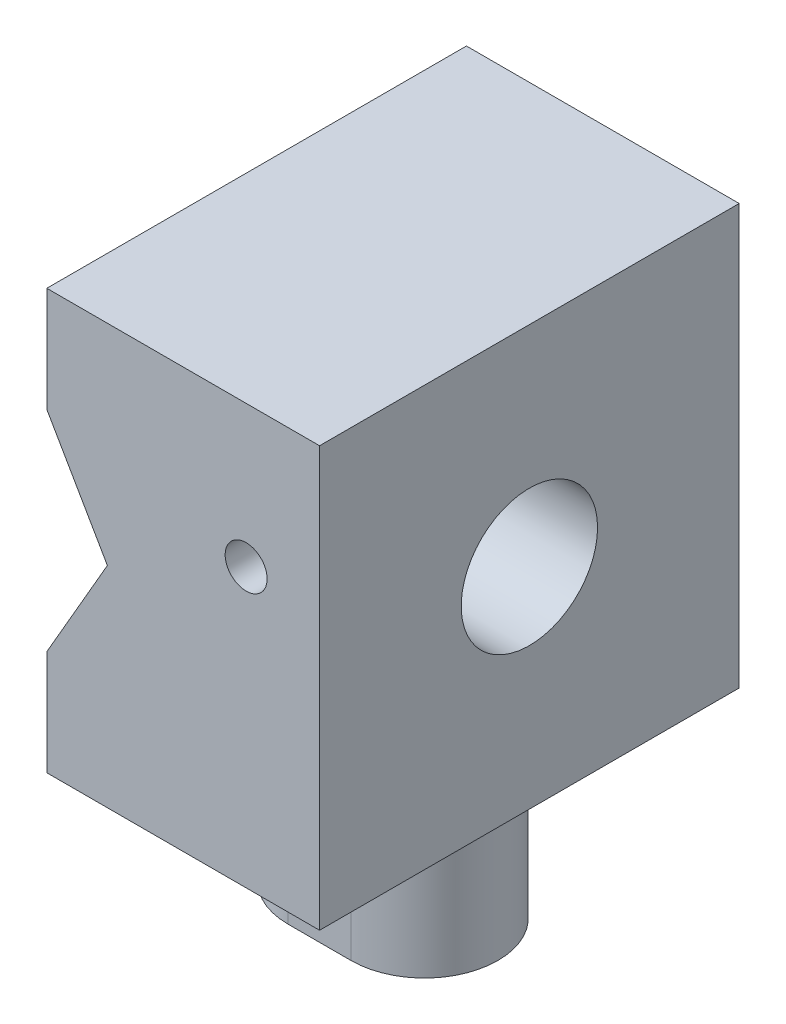
ISO-10303-21;
HEADER;
FILE_DESCRIPTION(('STEP AP214'),'2;1');
FILE_NAME('part.step','',(''),(''),'','','');
FILE_SCHEMA(('AUTOMOTIVE_DESIGN { 1 0 10303 214 1 1 1 1 }'));
ENDSEC;
DATA;
#1=APPLICATION_CONTEXT('core data for automotive mechanical design processes');
#2=APPLICATION_PROTOCOL_DEFINITION('international standard','automotive_design',2000,#1);
#3=PRODUCT_CONTEXT('',#1,'mechanical');
#4=PRODUCT('Part','Part','',(#3));
#5=PRODUCT_RELATED_PRODUCT_CATEGORY('part','',(#4));
#6=PRODUCT_DEFINITION_FORMATION('','',#4);
#7=PRODUCT_DEFINITION_CONTEXT('part definition',#1,'design');
#8=PRODUCT_DEFINITION('design','',#6,#7);
#9=PRODUCT_DEFINITION_SHAPE('','',#8);
#10=(LENGTH_UNIT() NAMED_UNIT(*) SI_UNIT(.MILLI.,.METRE.));
#11=(NAMED_UNIT(*) PLANE_ANGLE_UNIT() SI_UNIT($,.RADIAN.));
#12=(NAMED_UNIT(*) SI_UNIT($,.STERADIAN.) SOLID_ANGLE_UNIT());
#13=UNCERTAINTY_MEASURE_WITH_UNIT(LENGTH_MEASURE(1.E-05),#10,'distance_accuracy_value','');
#14=(GEOMETRIC_REPRESENTATION_CONTEXT(3) GLOBAL_UNCERTAINTY_ASSIGNED_CONTEXT((#13)) GLOBAL_UNIT_ASSIGNED_CONTEXT((#10,
#11,#12)) REPRESENTATION_CONTEXT('',''));
#15=CARTESIAN_POINT('',(0.,0.,0.));
#16=DIRECTION('',(0.,0.,1.));
#17=DIRECTION('',(1.,0.,0.));
#18=AXIS2_PLACEMENT_3D('',#15,#16,#17);
#19=CARTESIAN_POINT('',(-11.8648849233218,10.,-40.));
#20=DIRECTION('',(-1.,0.,0.));
#21=DIRECTION('',(0.,-1.,0.));
#22=AXIS2_PLACEMENT_3D('',#19,#20,#21);
#23=PLANE('',#22);
#24=DIRECTION('',(0.,-1.,0.));
#25=VECTOR('',#24,1.);
#26=CARTESIAN_POINT('',(-11.8648849233218,10.,0.));
#27=LINE('',#26,#25);
#28=CARTESIAN_POINT('',(-11.8648849233218,10.,0.));
#29=VERTEX_POINT('',#28);
#30=CARTESIAN_POINT('',(-11.8648849233218,0.,0.));
#31=VERTEX_POINT('',#30);
#32=EDGE_CURVE('E179',#29,#31,#27,.T.);
#33=ORIENTED_EDGE('',*,*,#32,.F.);
#34=DIRECTION('',(0.,0.,1.));
#35=VECTOR('',#34,1.);
#36=CARTESIAN_POINT('',(-11.8648849233218,10.,-40.));
#37=LINE('',#36,#35);
#38=CARTESIAN_POINT('',(-11.8648849233218,10.,-40.));
#39=VERTEX_POINT('',#38);
#40=EDGE_CURVE('E50',#39,#29,#37,.T.);
#41=ORIENTED_EDGE('',*,*,#40,.F.);
#42=DIRECTION('',(0.,-1.,0.));
#43=VECTOR('',#42,1.);
#44=CARTESIAN_POINT('',(-11.8648849233218,10.,-40.));
#45=LINE('',#44,#43);
#46=CARTESIAN_POINT('',(-11.8648849233218,0.,-40.));
#47=VERTEX_POINT('',#46);
#48=EDGE_CURVE('E180',#39,#47,#45,.T.);
#49=ORIENTED_EDGE('',*,*,#48,.T.);
#50=DIRECTION('',(0.,0.,1.));
#51=VECTOR('',#50,1.);
#52=CARTESIAN_POINT('',(-11.8648849233218,0.,-40.));
#53=LINE('',#52,#51);
#54=EDGE_CURVE('E202',#47,#31,#53,.T.);
#55=ORIENTED_EDGE('',*,*,#54,.T.);
#56=EDGE_LOOP('',(#33,#41,#49,#55));
#57=FACE_BOUND('',#56,.T.);
#58=ADVANCED_FACE('F36',(#57),#23,.T.);
#59=CARTESIAN_POINT('',(-6.09138223142557,20.,-40.));
#60=DIRECTION('',(-0.866025403784438,0.500000000000001,0.));
#61=DIRECTION('',(-0.500000000000001,-0.866025403784438,0.));
#62=AXIS2_PLACEMENT_3D('',#59,#60,#61);
#63=PLANE('',#62);
#64=DIRECTION('',(-0.500000000000001,-0.866025403784438,0.));
#65=VECTOR('',#64,1.);
#66=CARTESIAN_POINT('',(-6.09138223142557,20.,0.));
#67=LINE('',#66,#65);
#68=CARTESIAN_POINT('',(-6.09138223142557,20.,0.));
#69=VERTEX_POINT('',#68);
#70=EDGE_CURVE('E184',#69,#29,#67,.T.);
#71=ORIENTED_EDGE('',*,*,#70,.F.);
#72=DIRECTION('',(0.,0.,1.));
#73=VECTOR('',#72,1.);
#74=CARTESIAN_POINT('',(-6.09138223142557,20.,-40.));
#75=LINE('',#74,#73);
#76=CARTESIAN_POINT('',(-6.09138223142557,20.,-40.));
#77=VERTEX_POINT('',#76);
#78=EDGE_CURVE('E223',#77,#69,#75,.T.);
#79=ORIENTED_EDGE('',*,*,#78,.F.);
#80=DIRECTION('',(-0.500000000000001,-0.866025403784438,0.));
#81=VECTOR('',#80,1.);
#82=CARTESIAN_POINT('',(-6.09138223142557,20.,-40.));
#83=LINE('',#82,#81);
#84=EDGE_CURVE('E199',#77,#39,#83,.T.);
#85=ORIENTED_EDGE('',*,*,#84,.T.);
#86=ORIENTED_EDGE('',*,*,#40,.T.);
#87=EDGE_LOOP('',(#71,#79,#85,#86));
#88=FACE_BOUND('',#87,.T.);
#89=ADVANCED_FACE('F246',(#88),#63,.T.);
#90=CARTESIAN_POINT('',(-11.8648849233218,30.,-40.));
#91=DIRECTION('',(-0.866025403784438,-0.500000000000001,0.));
#92=DIRECTION('',(0.500000000000001,-0.866025403784438,0.));
#93=AXIS2_PLACEMENT_3D('',#90,#91,#92);
#94=PLANE('',#93);
#95=DIRECTION('',(0.500000000000001,-0.866025403784438,0.));
#96=VECTOR('',#95,1.);
#97=CARTESIAN_POINT('',(-11.8648849233218,30.,0.));
#98=LINE('',#97,#96);
#99=CARTESIAN_POINT('',(-11.8648849233218,30.,0.));
#100=VERTEX_POINT('',#99);
#101=EDGE_CURVE('E217',#100,#69,#98,.T.);
#102=ORIENTED_EDGE('',*,*,#101,.F.);
#103=DIRECTION('',(0.,0.,1.));
#104=VECTOR('',#103,1.);
#105=CARTESIAN_POINT('',(-11.8648849233218,30.,-40.));
#106=LINE('',#105,#104);
#107=CARTESIAN_POINT('',(-11.8648849233218,30.,-40.));
#108=VERTEX_POINT('',#107);
#109=EDGE_CURVE('E225',#108,#100,#106,.T.);
#110=ORIENTED_EDGE('',*,*,#109,.F.);
#111=DIRECTION('',(0.500000000000001,-0.866025403784438,0.));
#112=VECTOR('',#111,1.);
#113=CARTESIAN_POINT('',(-11.8648849233218,30.,-40.));
#114=LINE('',#113,#112);
#115=EDGE_CURVE('E196',#108,#77,#114,.T.);
#116=ORIENTED_EDGE('',*,*,#115,.T.);
#117=ORIENTED_EDGE('',*,*,#78,.T.);
#118=EDGE_LOOP('',(#102,#110,#116,#117));
#119=FACE_BOUND('',#118,.T.);
#120=ADVANCED_FACE('F263',(#119),#94,.T.);
#121=CARTESIAN_POINT('',(-11.8648849233218,40.,-40.));
#122=DIRECTION('',(-1.,0.,0.));
#123=DIRECTION('',(0.,0.,1.));
#124=AXIS2_PLACEMENT_3D('',#121,#122,#123);
#125=PLANE('',#124);
#126=DIRECTION('',(0.,-1.,0.));
#127=VECTOR('',#126,1.);
#128=CARTESIAN_POINT('',(-11.8648849233218,40.,0.));
#129=LINE('',#128,#127);
#130=CARTESIAN_POINT('',(-11.8648849233218,40.,0.));
#131=VERTEX_POINT('',#130);
#132=EDGE_CURVE('E214',#131,#100,#129,.T.);
#133=ORIENTED_EDGE('',*,*,#132,.F.);
#134=DIRECTION('',(0.,0.,1.));
#135=VECTOR('',#134,1.);
#136=CARTESIAN_POINT('',(-11.8648849233218,40.,-40.));
#137=LINE('',#136,#135);
#138=CARTESIAN_POINT('',(-11.8648849233218,40.,-40.));
#139=VERTEX_POINT('',#138);
#140=EDGE_CURVE('E227',#139,#131,#137,.T.);
#141=ORIENTED_EDGE('',*,*,#140,.F.);
#142=DIRECTION('',(0.,-1.,0.));
#143=VECTOR('',#142,1.);
#144=CARTESIAN_POINT('',(-11.8648849233218,40.,-40.));
#145=LINE('',#144,#143);
#146=EDGE_CURVE('E193',#139,#108,#145,.T.);
#147=ORIENTED_EDGE('',*,*,#146,.T.);
#148=ORIENTED_EDGE('',*,*,#109,.T.);
#149=EDGE_LOOP('',(#133,#141,#147,#148));
#150=FACE_BOUND('',#149,.T.);
#151=ADVANCED_FACE('F261',(#150),#125,.T.);
#152=CARTESIAN_POINT('',(-11.8648849233218,40.,-40.));
#153=DIRECTION('',(0.,1.,0.));
#154=DIRECTION('',(0.,0.,1.));
#155=AXIS2_PLACEMENT_3D('',#152,#153,#154);
#156=PLANE('',#155);
#157=DIRECTION('',(-1.,0.,0.));
#158=VECTOR('',#157,1.);
#159=CARTESIAN_POINT('',(-11.8648849233218,40.,0.));
#160=LINE('',#159,#158);
#161=CARTESIAN_POINT('',(14.1351150766782,40.,0.));
#162=VERTEX_POINT('',#161);
#163=EDGE_CURVE('E211',#162,#131,#160,.T.);
#164=ORIENTED_EDGE('',*,*,#163,.F.);
#165=DIRECTION('',(0.,0.,1.));
#166=VECTOR('',#165,1.);
#167=CARTESIAN_POINT('',(14.1351150766782,40.,-40.));
#168=LINE('',#167,#166);
#169=CARTESIAN_POINT('',(14.1351150766782,40.,-40.));
#170=VERTEX_POINT('',#169);
#171=EDGE_CURVE('E229',#170,#162,#168,.T.);
#172=ORIENTED_EDGE('',*,*,#171,.F.);
#173=DIRECTION('',(-1.,0.,0.));
#174=VECTOR('',#173,1.);
#175=CARTESIAN_POINT('',(-11.8648849233218,40.,-40.));
#176=LINE('',#175,#174);
#177=EDGE_CURVE('E190',#170,#139,#176,.T.);
#178=ORIENTED_EDGE('',*,*,#177,.T.);
#179=ORIENTED_EDGE('',*,*,#140,.T.);
#180=EDGE_LOOP('',(#164,#172,#178,#179));
#181=FACE_BOUND('',#180,.T.);
#182=ADVANCED_FACE('F259',(#181),#156,.T.);
#183=CARTESIAN_POINT('',(14.1351150766782,0.,-40.));
#184=DIRECTION('',(1.,0.,0.));
#185=DIRECTION('',(0.,0.,-1.));
#186=AXIS2_PLACEMENT_3D('',#183,#184,#185);
#187=PLANE('',#186);
#188=CARTESIAN_POINT('',(14.1351150766782,20.,-20.));
#189=DIRECTION('',(1.,0.,0.));
#190=DIRECTION('',(0.,0.,-1.));
#191=AXIS2_PLACEMENT_3D('',#188,#189,#190);
#192=CIRCLE('',#191,6.5);
#193=CARTESIAN_POINT('',(14.1351150766782,20.,-26.5));
#194=VERTEX_POINT('',#193);
#195=EDGE_CURVE('E176',#194,#194,#192,.T.);
#196=ORIENTED_EDGE('',*,*,#195,.F.);
#197=EDGE_LOOP('',(#196));
#198=FACE_BOUND('',#197,.T.);
#199=DIRECTION('',(0.,1.,0.));
#200=VECTOR('',#199,1.);
#201=CARTESIAN_POINT('',(14.1351150766782,0.,0.));
#202=LINE('',#201,#200);
#203=CARTESIAN_POINT('',(14.1351150766782,0.,0.));
#204=VERTEX_POINT('',#203);
#205=EDGE_CURVE('E208',#204,#162,#202,.T.);
#206=ORIENTED_EDGE('',*,*,#205,.F.);
#207=DIRECTION('',(0.,0.,1.));
#208=VECTOR('',#207,1.);
#209=CARTESIAN_POINT('',(14.1351150766782,0.,-40.));
#210=LINE('',#209,#208);
#211=CARTESIAN_POINT('',(14.1351150766782,0.,-40.));
#212=VERTEX_POINT('',#211);
#213=EDGE_CURVE('E231',#212,#204,#210,.T.);
#214=ORIENTED_EDGE('',*,*,#213,.F.);
#215=DIRECTION('',(0.,1.,0.));
#216=VECTOR('',#215,1.);
#217=CARTESIAN_POINT('',(14.1351150766782,0.,-40.));
#218=LINE('',#217,#216);
#219=EDGE_CURVE('E187',#212,#170,#218,.T.);
#220=ORIENTED_EDGE('',*,*,#219,.T.);
#221=ORIENTED_EDGE('',*,*,#171,.T.);
#222=EDGE_LOOP('',(#206,#214,#220,#221));
#223=FACE_BOUND('',#222,.T.);
#224=ADVANCED_FACE('F255',(#198,#223),#187,.T.);
#225=CARTESIAN_POINT('',(-11.8648849233218,0.,-40.));
#226=DIRECTION('',(0.,-1.,0.));
#227=DIRECTION('',(0.,0.,-1.));
#228=AXIS2_PLACEMENT_3D('',#225,#226,#227);
#229=PLANE('',#228);
#230=CARTESIAN_POINT('',(-1.86488492332184,0.,-20.));
#231=DIRECTION('',(0.,-1.,0.));
#232=DIRECTION('',(0.,0.,-1.));
#233=AXIS2_PLACEMENT_3D('',#230,#231,#232);
#234=CIRCLE('',#233,7.);
#235=CARTESIAN_POINT('',(-1.86488492332184,0.,-13.));
#236=VERTEX_POINT('',#235);
#237=CARTESIAN_POINT('',(-1.86488492332184,0.,-27.));
#238=VERTEX_POINT('',#237);
#239=EDGE_CURVE('E57',#236,#238,#234,.T.);
#240=ORIENTED_EDGE('',*,*,#239,.F.);
#241=DIRECTION('',(-1.,0.,0.));
#242=VECTOR('',#241,1.);
#243=CARTESIAN_POINT('',(-1.86488492332184,0.,-13.));
#244=LINE('',#243,#242);
#245=CARTESIAN_POINT('',(4.13511507667816,0.,-13.));
#246=VERTEX_POINT('',#245);
#247=EDGE_CURVE('E61',#246,#236,#244,.T.);
#248=ORIENTED_EDGE('',*,*,#247,.F.);
#249=CARTESIAN_POINT('',(4.13511507667816,0.,-20.));
#250=DIRECTION('',(0.,-1.,0.));
#251=DIRECTION('',(0.,0.,-1.));
#252=AXIS2_PLACEMENT_3D('',#249,#250,#251);
#253=CIRCLE('',#252,7.);
#254=CARTESIAN_POINT('',(4.13511507667816,0.,-27.));
#255=VERTEX_POINT('',#254);
#256=EDGE_CURVE('E156',#255,#246,#253,.T.);
#257=ORIENTED_EDGE('',*,*,#256,.F.);
#258=DIRECTION('',(1.,0.,0.));
#259=VECTOR('',#258,1.);
#260=CARTESIAN_POINT('',(-1.86488492332184,0.,-27.));
#261=LINE('',#260,#259);
#262=EDGE_CURVE('E139',#238,#255,#261,.T.);
#263=ORIENTED_EDGE('',*,*,#262,.F.);
#264=EDGE_LOOP('',(#240,#248,#257,#263));
#265=FACE_BOUND('',#264,.T.);
#266=DIRECTION('',(1.,0.,0.));
#267=VECTOR('',#266,1.);
#268=CARTESIAN_POINT('',(-11.8648849233218,0.,0.));
#269=LINE('',#268,#267);
#270=EDGE_CURVE('E205',#31,#204,#269,.T.);
#271=ORIENTED_EDGE('',*,*,#270,.F.);
#272=ORIENTED_EDGE('',*,*,#54,.F.);
#273=DIRECTION('',(1.,0.,0.));
#274=VECTOR('',#273,1.);
#275=CARTESIAN_POINT('',(-11.8648849233218,0.,-40.));
#276=LINE('',#275,#274);
#277=EDGE_CURVE('E183',#47,#212,#276,.T.);
#278=ORIENTED_EDGE('',*,*,#277,.T.);
#279=ORIENTED_EDGE('',*,*,#213,.T.);
#280=EDGE_LOOP('',(#271,#272,#278,#279));
#281=FACE_BOUND('',#280,.T.);
#282=ADVANCED_FACE('F239',(#265,#281),#229,.T.);
#283=CARTESIAN_POINT('',(0.,0.,-40.));
#284=DIRECTION('',(0.,0.,1.));
#285=DIRECTION('',(1.,0.,0.));
#286=AXIS2_PLACEMENT_3D('',#283,#284,#285);
#287=PLANE('',#286);
#288=CARTESIAN_POINT('',(7.13511507667816,26.5,-40.));
#289=DIRECTION('',(0.,0.,1.));
#290=DIRECTION('',(1.,0.,0.));
#291=AXIS2_PLACEMENT_3D('',#288,#289,#290);
#292=CIRCLE('',#291,2.);
#293=CARTESIAN_POINT('',(9.13511507667816,26.5,-40.));
#294=VERTEX_POINT('',#293);
#295=EDGE_CURVE('E171',#294,#294,#292,.T.);
#296=ORIENTED_EDGE('',*,*,#295,.T.);
#297=EDGE_LOOP('',(#296));
#298=FACE_BOUND('',#297,.T.);
#299=ORIENTED_EDGE('',*,*,#48,.F.);
#300=ORIENTED_EDGE('',*,*,#84,.F.);
#301=ORIENTED_EDGE('',*,*,#115,.F.);
#302=ORIENTED_EDGE('',*,*,#146,.F.);
#303=ORIENTED_EDGE('',*,*,#177,.F.);
#304=ORIENTED_EDGE('',*,*,#219,.F.);
#305=ORIENTED_EDGE('',*,*,#277,.F.);
#306=EDGE_LOOP('',(#299,#300,#301,#302,#303,#304,#305));
#307=FACE_BOUND('',#306,.T.);
#308=ADVANCED_FACE('F249',(#298,#307),#287,.F.);
#309=CARTESIAN_POINT('',(0.,0.,0.));
#310=DIRECTION('',(0.,0.,1.));
#311=DIRECTION('',(1.,0.,0.));
#312=AXIS2_PLACEMENT_3D('',#309,#310,#311);
#313=PLANE('',#312);
#314=CARTESIAN_POINT('',(7.13511507667816,26.5,0.));
#315=DIRECTION('',(0.,0.,1.));
#316=DIRECTION('',(1.,0.,0.));
#317=AXIS2_PLACEMENT_3D('',#314,#315,#316);
#318=CIRCLE('',#317,2.);
#319=CARTESIAN_POINT('',(9.13511507667816,26.5,0.));
#320=VERTEX_POINT('',#319);
#321=EDGE_CURVE('E170',#320,#320,#318,.T.);
#322=ORIENTED_EDGE('',*,*,#321,.F.);
#323=EDGE_LOOP('',(#322));
#324=FACE_BOUND('',#323,.T.);
#325=ORIENTED_EDGE('',*,*,#32,.T.);
#326=ORIENTED_EDGE('',*,*,#270,.T.);
#327=ORIENTED_EDGE('',*,*,#205,.T.);
#328=ORIENTED_EDGE('',*,*,#163,.T.);
#329=ORIENTED_EDGE('',*,*,#132,.T.);
#330=ORIENTED_EDGE('',*,*,#101,.T.);
#331=ORIENTED_EDGE('',*,*,#70,.T.);
#332=EDGE_LOOP('',(#325,#326,#327,#328,#329,#330,#331));
#333=FACE_BOUND('',#332,.T.);
#334=ADVANCED_FACE('F242',(#324,#333),#313,.T.);
#335=CARTESIAN_POINT('',(-4.86488492332184,20.,-20.));
#336=DIRECTION('',(1.,0.,0.));
#337=DIRECTION('',(0.,0.,-1.));
#338=AXIS2_PLACEMENT_3D('',#335,#336,#337);
#339=CYLINDRICAL_SURFACE('',#338,6.5);
#340=CARTESIAN_POINT('',(9.13511507667816,26.5,-20.));
#341=CARTESIAN_POINT('',(9.13511141482666,26.5000005698477,-20.1693150910333));
#342=CARTESIAN_POINT('',(9.13514688000028,26.4933818269357,-20.3386185698709));
#343=CARTESIAN_POINT('',(9.13488650480406,26.4669430827981,-20.6762598632969));
#344=CARTESIAN_POINT('',(9.1345905463095,26.4471183757756,-20.8445973120768));
#345=CARTESIAN_POINT('',(9.13249698762282,26.3943537889792,-21.179406812894));
#346=CARTESIAN_POINT('',(9.13069752596658,26.3613976778878,-21.3458762931811));
#347=CARTESIAN_POINT('',(9.12365833507948,26.2825934144641,-21.6756281785793));
#348=CARTESIAN_POINT('',(9.11841992364302,26.2367502042724,-21.8389117798393));
#349=CARTESIAN_POINT('',(9.10435988378035,26.1487344652517,-22.1110910487648));
#350=CARTESIAN_POINT('',(9.09715500151494,26.1098387561842,-22.2211380013942));
#351=CARTESIAN_POINT('',(9.07868179465252,26.0263112854749,-22.4386755323985));
#352=CARTESIAN_POINT('',(9.06741440938601,25.9816808513482,-22.5461666956029));
#353=CARTESIAN_POINT('',(9.03951981721443,25.8870800636264,-22.7578425825167));
#354=CARTESIAN_POINT('',(9.022902610259,25.8371197882256,-22.8620330798613));
#355=CARTESIAN_POINT('',(8.98276947704603,25.732330120793,-23.0665273525963));
#356=CARTESIAN_POINT('',(8.95925662145406,25.6775029035954,-23.1668328355436));
#357=CARTESIAN_POINT('',(8.8951136120763,25.5464564506914,-23.3924272429688));
#358=CARTESIAN_POINT('',(8.85145420343546,25.4687948991298,-23.5160595698905));
#359=CARTESIAN_POINT('',(8.74506483998104,25.3095385431481,-23.7521952736841));
#360=CARTESIAN_POINT('',(8.68236059358774,25.2279491650313,-23.8647133838359));
#361=CARTESIAN_POINT('',(8.55248510853731,25.0865656789887,-24.0480520474662));
#362=CARTESIAN_POINT('',(8.49043116881558,25.026465586693,-24.1222310143397));
#363=CARTESIAN_POINT('',(8.35214268921347,24.9103582932194,-24.2598648613824));
#364=CARTESIAN_POINT('',(8.27592743790481,24.854345667496,-24.3233341071042));
#365=CARTESIAN_POINT('',(8.12465754167312,24.7601094355429,-24.4266624015211));
#366=CARTESIAN_POINT('',(8.0519693916188,24.720508981987,-24.4687169088767));
#367=CARTESIAN_POINT('',(7.89800380463677,24.6492756910771,-24.5427832540687));
#368=CARTESIAN_POINT('',(7.81672906599723,24.6176403612368,-24.5747982342961));
#369=CARTESIAN_POINT('',(7.64689558111122,24.5645317502899,-24.6277946378726));
#370=CARTESIAN_POINT('',(7.55829671295171,24.5431194855932,-24.6487098930993));
#371=CARTESIAN_POINT('',(7.37702718196385,24.5125617738393,-24.6783816639864));
#372=CARTESIAN_POINT('',(7.28435830434524,24.5034110029932,-24.687143456588));
#373=CARTESIAN_POINT('',(7.10799554090236,24.4984424629711,-24.6919096221014));
#374=CARTESIAN_POINT('',(7.02436657776386,24.5013414749492,-24.6891417526228));
#375=CARTESIAN_POINT('',(6.85905980662428,24.5174045961648,-24.6736686872532));
#376=CARTESIAN_POINT('',(6.77738156169324,24.5305663840528,-24.6609657385877));
#377=CARTESIAN_POINT('',(6.61971987483335,24.565890574912,-24.6263628008792));
#378=CARTESIAN_POINT('',(6.54365899898036,24.5878818395483,-24.6046374293149));
#379=CARTESIAN_POINT('',(6.39727198110687,24.6394581292531,-24.5526655098414));
#380=CARTESIAN_POINT('',(6.32694682871146,24.6690444611156,-24.5224174954536));
#381=CARTESIAN_POINT('',(6.18770459092189,24.7367963709389,-24.4514429178307));
#382=CARTESIAN_POINT('',(6.11936702706618,24.7754639491478,-24.4100642841074));
#383=CARTESIAN_POINT('',(5.99134673831772,24.8575657533418,-24.3194682788887));
#384=CARTESIAN_POINT('',(5.93166891639585,24.9010026553644,-24.2702464995933));
#385=CARTESIAN_POINT('',(5.79196001085189,25.0141612080853,-24.1375342010547));
#386=CARTESIAN_POINT('',(5.71764146102659,25.0857331907523,-24.0495985122769));
#387=CARTESIAN_POINT('',(5.58718767599084,25.2297934824344,-23.8617799855301));
#388=CARTESIAN_POINT('',(5.5310946911797,25.3022835215134,-23.7618701120976));
#389=CARTESIAN_POINT('',(5.44577020655872,25.4274364168861,-23.5780199636007));
#390=CARTESIAN_POINT('',(5.41332300353519,25.4807119425761,-23.4959383789601));
#391=CARTESIAN_POINT('',(5.35592669609509,25.5845695072355,-23.3275172289545));
#392=CARTESIAN_POINT('',(5.33098166637334,25.6351500702486,-23.2411753792162));
#393=CARTESIAN_POINT('',(5.28728259459734,25.7329353700896,-23.0649037096678));
#394=CARTESIAN_POINT('',(5.26853958552733,25.7801339750609,-22.9749678113312));
#395=CARTESIAN_POINT('',(5.23612854393626,25.8705911668819,-22.7922328678054));
#396=CARTESIAN_POINT('',(5.22246220784589,25.9138484330485,-22.699432876745));
#397=CARTESIAN_POINT('',(5.192276397575,26.0203949183801,-22.4559034900246));
#398=CARTESIAN_POINT('',(5.17884421199939,26.0804138428415,-22.3033514856255));
#399=CARTESIAN_POINT('',(5.15869706692219,26.1888617134059,-21.9937262852442));
#400=CARTESIAN_POINT('',(5.15198587509949,26.2372841471479,-21.8366506040591));
#401=CARTESIAN_POINT('',(5.14258265120325,26.3221314317075,-21.5191027136872));
#402=CARTESIAN_POINT('',(5.13989257855097,26.3585504267255,-21.3586288872428));
#403=CARTESIAN_POINT('',(5.13652167940198,26.4191106541993,-21.0354006238749));
#404=CARTESIAN_POINT('',(5.13584048509145,26.4432541335596,-20.872646609924));
#405=CARTESIAN_POINT('',(5.13513010141134,26.4797812566719,-20.5398658449667));
#406=CARTESIAN_POINT('',(5.13512535915444,26.491708482757,-20.3697887914378));
#407=CARTESIAN_POINT('',(5.13510948275996,26.5021670433779,-20.029208466293));
#408=CARTESIAN_POINT('',(5.13509834802353,26.5006971226756,-19.8587051562356));
#409=CARTESIAN_POINT('',(5.13515969724134,26.4843652102306,-19.5182730012779));
#410=CARTESIAN_POINT('',(5.13523221509453,26.4694977898878,-19.3483444172719));
#411=CARTESIAN_POINT('',(5.13635136849478,26.4264560145059,-19.0102002904135));
#412=CARTESIAN_POINT('',(5.13739786599289,26.3982835455631,-18.8419845082096));
#413=CARTESIAN_POINT('',(5.14183059836214,26.3335188440897,-18.530899599692));
#414=CARTESIAN_POINT('',(5.14488121069909,26.2985809143018,-18.3876796659321));
#415=CARTESIAN_POINT('',(5.15453695698339,26.2190787732599,-18.1040164781806));
#416=CARTESIAN_POINT('',(5.16114264508838,26.1745130618963,-17.9635736606193));
#417=CARTESIAN_POINT('',(5.17989712944707,26.0761786100927,-17.6866500584443));
#418=CARTESIAN_POINT('',(5.19203359470176,26.0224305077729,-17.5501611746236));
#419=CARTESIAN_POINT('',(5.22433388427066,25.9062420475631,-17.2819793950776));
#420=CARTESIAN_POINT('',(5.24449214329253,25.8438077354086,-17.1502832432834));
#421=CARTESIAN_POINT('',(5.29836658996585,25.7047264838398,-16.8804999067916));
#422=CARTESIAN_POINT('',(5.33320918473031,25.6272881562196,-16.7430338233405));
#423=CARTESIAN_POINT('',(5.42100692574279,25.4654506441504,-16.4782387044842));
#424=CARTESIAN_POINT('',(5.47394316350155,25.3810587959678,-16.3508992569501));
#425=CARTESIAN_POINT('',(5.58929158989394,25.2281845831017,-16.136116814085));
#426=CARTESIAN_POINT('',(5.64723757779557,25.1601712631716,-16.0459740343987));
#427=CARTESIAN_POINT('',(5.77982057909565,25.0262237350879,-15.8770613664266));
#428=CARTESIAN_POINT('',(5.85443053805895,24.9602863523701,-15.7982733806411));
#429=CARTESIAN_POINT('',(6.00227589218658,24.8498111989017,-15.6716368173088));
#430=CARTESIAN_POINT('',(6.07189493670826,24.8038357189273,-15.6208377605719));
#431=CARTESIAN_POINT('',(6.22139982844105,24.7188482927482,-15.5293888401664));
#432=CARTESIAN_POINT('',(6.30128217145081,24.6798339806002,-15.4887355263093));
#433=CARTESIAN_POINT('',(6.47058338556627,24.6114055947643,-15.4188023414847));
#434=CARTESIAN_POINT('',(6.56007042091685,24.5820671047553,-15.3896116901985));
#435=CARTESIAN_POINT('',(6.74540118315521,24.5360208699159,-15.3442957323828));
#436=CARTESIAN_POINT('',(6.84124060269823,24.5193046597326,-15.3281616687025));
#437=CARTESIAN_POINT('',(7.02324956975216,24.5013079482264,-15.3108259079257));
#438=CARTESIAN_POINT('',(7.10910167868276,24.4983369424645,-15.3079882345937));
#439=CARTESIAN_POINT('',(7.28015589241533,24.5034343897133,-15.3128799868383));
#440=CARTESIAN_POINT('',(7.36535821595037,24.5114989465478,-15.3206056829489));
#441=CARTESIAN_POINT('',(7.52840576316417,24.5373972091776,-15.3457197805137));
#442=CARTESIAN_POINT('',(7.6064071921808,24.5547358972559,-15.3626191534918));
#443=CARTESIAN_POINT('',(7.75754493583721,24.5976970476811,-15.4052103967439));
#444=CARTESIAN_POINT('',(7.83068099021035,24.623319952752,-15.4309027369347));
#445=CARTESIAN_POINT('',(7.97462672024094,24.6829616934847,-15.4920313265951));
#446=CARTESIAN_POINT('',(8.04507405321724,24.7173717679013,-15.5279344286791));
#447=CARTESIAN_POINT('',(8.17803595185346,24.79174577941,-15.6077165550521));
#448=CARTESIAN_POINT('',(8.24054620222944,24.8317127131633,-15.6515998868177));
#449=CARTESIAN_POINT('',(8.3840163810958,24.9343746337652,-15.7679379400786));
#450=CARTESIAN_POINT('',(8.46036220279663,24.9991127083962,-15.8442876565264));
#451=CARTESIAN_POINT('',(8.59647840255181,25.1312527553322,-16.0085842795608));
#452=CARTESIAN_POINT('',(8.65621516603597,25.198659819026,-16.0965541810063));
#453=CARTESIAN_POINT('',(8.74742955752491,25.3149351015078,-16.2571930574308));
#454=CARTESIAN_POINT('',(8.78221347839883,25.3640500457836,-16.3278628359563));
#455=CARTESIAN_POINT('',(8.84486691941383,25.460735840581,-16.4732476309608));
#456=CARTESIAN_POINT('',(8.8727329981042,25.5083059123811,-16.5479646384086));
#457=CARTESIAN_POINT('',(8.92256419272162,25.6012173242188,-16.7008507618331));
#458=CARTESIAN_POINT('',(8.94451846377364,25.6465544452636,-16.779025919946));
#459=CARTESIAN_POINT('',(8.98340610741202,25.7344114153461,-16.9381708771924));
#460=CARTESIAN_POINT('',(9.00033773799275,25.7769302829658,-17.019141635081));
#461=CARTESIAN_POINT('',(9.03930944558841,25.8843217769145,-17.2346893484662));
#462=CARTESIAN_POINT('',(9.05794460551777,25.9465876726972,-17.3711890431336));
#463=CARTESIAN_POINT('',(9.08741745388727,26.0617709067483,-17.6489189618349));
#464=CARTESIAN_POINT('',(9.09824993419096,26.1146819831147,-17.790152279784));
#465=CARTESIAN_POINT('',(9.11466866393286,26.21062710429,-18.0762347848415));
#466=CARTESIAN_POINT('',(9.12025429303545,26.2536599807442,-18.221084397427));
#467=CARTESIAN_POINT('',(9.12820018180841,26.3295292073208,-18.5134370997458));
#468=CARTESIAN_POINT('',(9.1305616107042,26.362369250437,-18.6609392079061));
#469=CARTESIAN_POINT('',(9.13410874238202,26.4265887985955,-19.0056298709404));
#470=CARTESIAN_POINT('',(9.13467285141968,26.4541083821299,-19.2035545911884));
#471=CARTESIAN_POINT('',(9.13517802504431,26.4908092093756,-19.6009921250122));
#472=CARTESIAN_POINT('',(9.13511939126272,26.4999993285757,-19.8005041229853));
#473=CARTESIAN_POINT('',(9.13511507667816,26.5,-20.));
#474=B_SPLINE_CURVE_WITH_KNOTS('',3,(#340,#341,#342,#343,#344,#345,#346,#347,#348,#349,#350,
#351,#352,#353,#354,#355,#356,#357,#358,#359,#360,#361,#362,#363,#364,#365,#366,#367,#368,#369,
#370,#371,#372,#373,#374,#375,#376,#377,#378,#379,#380,#381,#382,#383,#384,#385,#386,#387,#388,
#389,#390,#391,#392,#393,#394,#395,#396,#397,#398,#399,#400,#401,#402,#403,#404,#405,#406,#407,
#408,#409,#410,#411,#412,#413,#414,#415,#416,#417,#418,#419,#420,#421,#422,#423,#424,#425,#426,
#427,#428,#429,#430,#431,#432,#433,#434,#435,#436,#437,#438,#439,#440,#441,#442,#443,#444,#445,
#446,#447,#448,#449,#450,#451,#452,#453,#454,#455,#456,#457,#458,#459,#460,#461,#462,#463,#464,
#465,#466,#467,#468,#469,#470,#471,#472,#473),.UNSPECIFIED.,.T.,.F.,(4,2,2,2,2,2,2,2,2,2,2,2,2,
2,2,2,2,2,2,2,2,2,2,2,2,2,2,2,2,2,2,2,2,2,2,2,2,2,2,2,2,2,2,2,2,2,2,2,2,2,2,2,2,2,2,2,2,2,2,2,2,
2,2,2,2,2,4),(0.,0.507796678543735,1.01577440158735,1.52438197757231,2.03279477045871,
2.38341078887924,2.73394578992362,3.08382933443155,3.4335573100747,3.8894248851384,
4.34467980405296,4.68508878810162,5.0250374687027,5.30243934872034,5.57975431456042,
5.85870436201013,6.13753325351309,6.38747218714854,6.63735460318903,6.88261097258429,
7.12790956867663,7.39315510850091,7.65855024388798,8.06295922988773,8.46829913437304,
8.77716608891185,9.08620049827575,9.39578174035581,9.70546633983016,10.1981769050705,
10.6911635214249,11.1843902833442,11.6775267327386,12.1884808763664,12.6994828940503,
13.2106920603548,13.721828780444,14.1638284256792,14.6058969888414,15.0469847354665,
15.4877669999805,15.9713488829434,16.4544269432613,16.8339147849486,17.2127909388484,
17.5046909543932,17.7964915699627,18.090520414877,18.3843518886249,18.6408724063027,
18.8973023811297,19.1412409719438,19.3851926014475,19.6428682859166,19.9006834706803,
20.276256232475,20.6525836615701,20.9306879035883,21.2089302194028,21.4876795304629,
21.7665254075932,22.2193679283841,22.6725124333311,23.1257105068478,23.5787441887204,
24.1773466634942,24.7756592126771),.UNSPECIFIED.);
#475=CARTESIAN_POINT('',(9.13511507667816,26.5,-20.));
#476=VERTEX_POINT('',#475);
#477=EDGE_CURVE('E40',#476,#476,#474,.T.);
#478=ORIENTED_EDGE('',*,*,#477,.T.);
#479=EDGE_LOOP('',(#478));
#480=FACE_BOUND('',#479,.T.);
#481=CARTESIAN_POINT('',(-0.864884923321844,20.,-20.));
#482=DIRECTION('',(1.,0.,0.));
#483=DIRECTION('',(0.,0.,-1.));
#484=AXIS2_PLACEMENT_3D('',#481,#482,#483);
#485=CIRCLE('',#484,6.5);
#486=CARTESIAN_POINT('',(-0.864884923321844,20.,-26.5));
#487=VERTEX_POINT('',#486);
#488=EDGE_CURVE('E11',#487,#487,#485,.F.);
#489=ORIENTED_EDGE('',*,*,#488,.T.);
#490=EDGE_LOOP('',(#489));
#491=FACE_BOUND('',#490,.T.);
#492=ORIENTED_EDGE('',*,*,#195,.T.);
#493=EDGE_LOOP('',(#492));
#494=FACE_BOUND('',#493,.T.);
#495=ADVANCED_FACE('F310',(#480,#491,#494),#339,.F.);
#496=CARTESIAN_POINT('',(-0.864884923321844,20.,-20.));
#497=DIRECTION('',(1.,0.,0.));
#498=DIRECTION('',(0.,0.,-1.));
#499=AXIS2_PLACEMENT_3D('',#496,#497,#498);
#500=CONICAL_SURFACE('',#499,6.49999999999998,1.01914134426635);
#501=ORIENTED_EDGE('',*,*,#488,.F.);
#502=EDGE_LOOP('',(#501));
#503=FACE_BOUND('',#502,.T.);
#504=CARTESIAN_POINT('',(-4.86488492332184,20.,-20.));
#505=VERTEX_POINT('',#504);
#506=VERTEX_LOOP('',#505);
#507=FACE_BOUND('',#506,.T.);
#508=ADVANCED_FACE('F38',(#503,#507),#500,.F.);
#509=CARTESIAN_POINT('',(7.13511507667816,26.5,-40.));
#510=DIRECTION('',(0.,0.,1.));
#511=DIRECTION('',(1.,0.,0.));
#512=AXIS2_PLACEMENT_3D('',#509,#510,#511);
#513=CYLINDRICAL_SURFACE('',#512,2.);
#514=ORIENTED_EDGE('',*,*,#321,.T.);
#515=EDGE_LOOP('',(#514));
#516=FACE_BOUND('',#515,.T.);
#517=ORIENTED_EDGE('',*,*,#295,.F.);
#518=EDGE_LOOP('',(#517));
#519=FACE_BOUND('',#518,.T.);
#520=ORIENTED_EDGE('',*,*,#477,.F.);
#521=EDGE_LOOP('',(#520));
#522=FACE_BOUND('',#521,.T.);
#523=ADVANCED_FACE('F323',(#516,#519,#522),#513,.F.);
#524=CARTESIAN_POINT('',(-1.86488492332184,-14.,-20.));
#525=DIRECTION('',(0.,1.,0.));
#526=DIRECTION('',(0.,0.,1.));
#527=AXIS2_PLACEMENT_3D('',#524,#525,#526);
#528=CYLINDRICAL_SURFACE('',#527,7.);
#529=ORIENTED_EDGE('',*,*,#239,.T.);
#530=DIRECTION('',(0.,1.,0.));
#531=VECTOR('',#530,1.);
#532=CARTESIAN_POINT('',(-1.86488492332184,-14.,-27.));
#533=LINE('',#532,#531);
#534=CARTESIAN_POINT('',(-1.86488492332184,-14.,-27.));
#535=VERTEX_POINT('',#534);
#536=EDGE_CURVE('E167',#535,#238,#533,.T.);
#537=ORIENTED_EDGE('',*,*,#536,.F.);
#538=CARTESIAN_POINT('',(-1.86488492332184,-14.,-20.));
#539=DIRECTION('',(0.,-1.,0.));
#540=DIRECTION('',(0.,0.,-1.));
#541=AXIS2_PLACEMENT_3D('',#538,#539,#540);
#542=CIRCLE('',#541,7.);
#543=CARTESIAN_POINT('',(-1.86488492332184,-14.,-13.));
#544=VERTEX_POINT('',#543);
#545=EDGE_CURVE('E144',#544,#535,#542,.T.);
#546=ORIENTED_EDGE('',*,*,#545,.F.);
#547=DIRECTION('',(0.,1.,0.));
#548=VECTOR('',#547,1.);
#549=CARTESIAN_POINT('',(-1.86488492332184,-14.,-13.));
#550=LINE('',#549,#548);
#551=EDGE_CURVE('E152',#544,#236,#550,.T.);
#552=ORIENTED_EDGE('',*,*,#551,.T.);
#553=EDGE_LOOP('',(#529,#537,#546,#552));
#554=FACE_BOUND('',#553,.T.);
#555=ADVANCED_FACE('F329',(#554),#528,.T.);
#556=CARTESIAN_POINT('',(-1.86488492332184,-14.,-27.));
#557=DIRECTION('',(0.,0.,1.));
#558=DIRECTION('',(1.,0.,0.));
#559=AXIS2_PLACEMENT_3D('',#556,#557,#558);
#560=PLANE('',#559);
#561=ORIENTED_EDGE('',*,*,#262,.T.);
#562=DIRECTION('',(0.,1.,0.));
#563=VECTOR('',#562,1.);
#564=CARTESIAN_POINT('',(4.13511507667816,-14.,-27.));
#565=LINE('',#564,#563);
#566=CARTESIAN_POINT('',(4.13511507667816,-14.,-27.));
#567=VERTEX_POINT('',#566);
#568=EDGE_CURVE('E164',#567,#255,#565,.T.);
#569=ORIENTED_EDGE('',*,*,#568,.F.);
#570=DIRECTION('',(1.,0.,0.));
#571=VECTOR('',#570,1.);
#572=CARTESIAN_POINT('',(-1.86488492332184,-14.,-27.));
#573=LINE('',#572,#571);
#574=EDGE_CURVE('E147',#535,#567,#573,.T.);
#575=ORIENTED_EDGE('',*,*,#574,.F.);
#576=ORIENTED_EDGE('',*,*,#536,.T.);
#577=EDGE_LOOP('',(#561,#569,#575,#576));
#578=FACE_BOUND('',#577,.T.);
#579=ADVANCED_FACE('F335',(#578),#560,.F.);
#580=CARTESIAN_POINT('',(4.13511507667816,-14.,-20.));
#581=DIRECTION('',(0.,1.,0.));
#582=DIRECTION('',(0.,0.,1.));
#583=AXIS2_PLACEMENT_3D('',#580,#581,#582);
#584=CYLINDRICAL_SURFACE('',#583,7.);
#585=ORIENTED_EDGE('',*,*,#256,.T.);
#586=DIRECTION('',(0.,1.,0.));
#587=VECTOR('',#586,1.);
#588=CARTESIAN_POINT('',(4.13511507667816,-14.,-13.));
#589=LINE('',#588,#587);
#590=CARTESIAN_POINT('',(4.13511507667816,-14.,-13.));
#591=VERTEX_POINT('',#590);
#592=EDGE_CURVE('E161',#591,#246,#589,.T.);
#593=ORIENTED_EDGE('',*,*,#592,.F.);
#594=CARTESIAN_POINT('',(4.13511507667816,-14.,-20.));
#595=DIRECTION('',(0.,-1.,0.));
#596=DIRECTION('',(0.,0.,-1.));
#597=AXIS2_PLACEMENT_3D('',#594,#595,#596);
#598=CIRCLE('',#597,7.);
#599=EDGE_CURVE('E149',#567,#591,#598,.T.);
#600=ORIENTED_EDGE('',*,*,#599,.F.);
#601=ORIENTED_EDGE('',*,*,#568,.T.);
#602=EDGE_LOOP('',(#585,#593,#600,#601));
#603=FACE_BOUND('',#602,.T.);
#604=ADVANCED_FACE('F343',(#603),#584,.T.);
#605=CARTESIAN_POINT('',(-1.86488492332184,-14.,-13.));
#606=DIRECTION('',(0.,0.,-1.));
#607=DIRECTION('',(-1.,0.,0.));
#608=AXIS2_PLACEMENT_3D('',#605,#606,#607);
#609=PLANE('',#608);
#610=ORIENTED_EDGE('',*,*,#247,.T.);
#611=ORIENTED_EDGE('',*,*,#551,.F.);
#612=DIRECTION('',(-1.,0.,0.));
#613=VECTOR('',#612,1.);
#614=CARTESIAN_POINT('',(-1.86488492332184,-14.,-13.));
#615=LINE('',#614,#613);
#616=EDGE_CURVE('E151',#591,#544,#615,.T.);
#617=ORIENTED_EDGE('',*,*,#616,.F.);
#618=ORIENTED_EDGE('',*,*,#592,.T.);
#619=EDGE_LOOP('',(#610,#611,#617,#618));
#620=FACE_BOUND('',#619,.T.);
#621=ADVANCED_FACE('F351',(#620),#609,.F.);
#622=CARTESIAN_POINT('',(-1.86488492332184,-14.,-20.));
#623=DIRECTION('',(0.,-1.,0.));
#624=DIRECTION('',(0.,0.,-1.));
#625=AXIS2_PLACEMENT_3D('',#622,#623,#624);
#626=PLANE('',#625);
#627=CARTESIAN_POINT('',(1.13511507667816,-14.,-20.));
#628=DIRECTION('',(0.,-1.,0.));
#629=DIRECTION('',(0.,0.,-1.));
#630=AXIS2_PLACEMENT_3D('',#627,#628,#629);
#631=CIRCLE('',#630,3.26389999999999);
#632=CARTESIAN_POINT('',(1.13511507667816,-14.,-23.2639));
#633=VERTEX_POINT('',#632);
#634=EDGE_CURVE('E137',#633,#633,#631,.T.);
#635=ORIENTED_EDGE('',*,*,#634,.F.);
#636=EDGE_LOOP('',(#635));
#637=FACE_BOUND('',#636,.T.);
#638=ORIENTED_EDGE('',*,*,#545,.T.);
#639=ORIENTED_EDGE('',*,*,#574,.T.);
#640=ORIENTED_EDGE('',*,*,#599,.T.);
#641=ORIENTED_EDGE('',*,*,#616,.T.);
#642=EDGE_LOOP('',(#638,#639,#640,#641));
#643=FACE_BOUND('',#642,.T.);
#644=ADVANCED_FACE('F131',(#637,#643),#626,.T.);
#645=CARTESIAN_POINT('',(1.13511507667816,-1.,-20.));
#646=DIRECTION('',(0.,-1.,0.));
#647=DIRECTION('',(0.,0.,-1.));
#648=AXIS2_PLACEMENT_3D('',#645,#646,#647);
#649=CONICAL_SURFACE('',#648,3.2639,1.02974425867665);
#650=CARTESIAN_POINT('',(1.13511507667816,0.961148974444055,-20.));
#651=VERTEX_POINT('',#650);
#652=VERTEX_LOOP('',#651);
#653=FACE_BOUND('',#652,.T.);
#654=CARTESIAN_POINT('',(1.13511507667816,-1.,-20.));
#655=DIRECTION('',(0.,-1.,0.));
#656=DIRECTION('',(0.,0.,-1.));
#657=AXIS2_PLACEMENT_3D('',#654,#655,#656);
#658=CIRCLE('',#657,3.2639);
#659=CARTESIAN_POINT('',(1.13511507667816,-1.,-23.2639));
#660=VERTEX_POINT('',#659);
#661=EDGE_CURVE('E135',#660,#660,#658,.T.);
#662=ORIENTED_EDGE('',*,*,#661,.T.);
#663=EDGE_LOOP('',(#662));
#664=FACE_BOUND('',#663,.T.);
#665=ADVANCED_FACE('F127',(#653,#664),#649,.F.);
#666=CARTESIAN_POINT('',(1.13511507667816,-14.,-20.));
#667=DIRECTION('',(0.,-1.,0.));
#668=DIRECTION('',(0.,0.,-1.));
#669=AXIS2_PLACEMENT_3D('',#666,#667,#668);
#670=CYLINDRICAL_SURFACE('',#669,3.26389999999999);
#671=ORIENTED_EDGE('',*,*,#661,.F.);
#672=EDGE_LOOP('',(#671));
#673=FACE_BOUND('',#672,.T.);
#674=ORIENTED_EDGE('',*,*,#634,.T.);
#675=EDGE_LOOP('',(#674));
#676=FACE_BOUND('',#675,.T.);
#677=ADVANCED_FACE('F130',(#673,#676),#670,.F.);
#678=CLOSED_SHELL('',(#58,#89,#120,#151,#182,#224,#282,#308,#334,#495,#508,#523,#555,#579,#604,
#621,#644,#665,#677));
#679=MANIFOLD_SOLID_BREP('B2',#678);
#680=ADVANCED_BREP_SHAPE_REPRESENTATION('',(#18,#679),#14);
#681=SHAPE_DEFINITION_REPRESENTATION(#9,#680);
ENDSEC;
END-ISO-10303-21;
